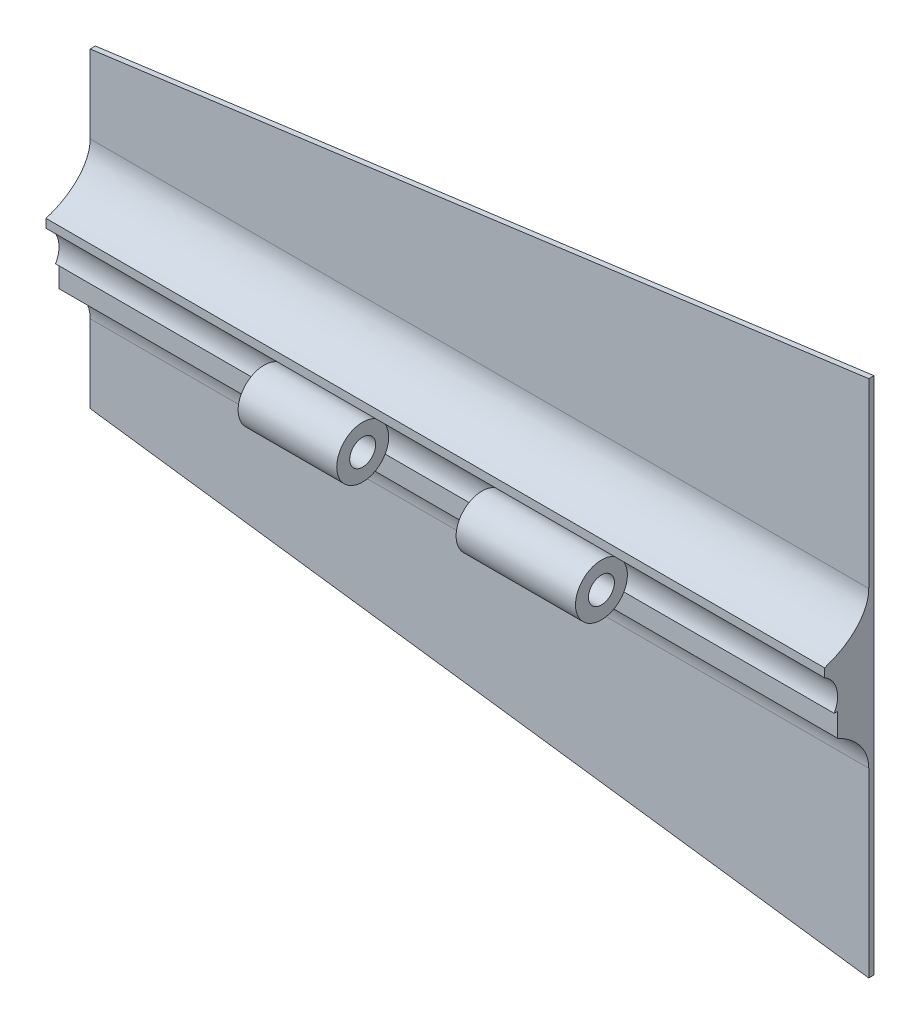
ISO-10303-21;
HEADER;
FILE_DESCRIPTION(('STEP AP214'),'2;1');
FILE_NAME('part.step','',(''),(''),'','','');
FILE_SCHEMA(('AUTOMOTIVE_DESIGN { 1 0 10303 214 1 1 1 1 }'));
ENDSEC;
DATA;
#1=APPLICATION_CONTEXT('core data for automotive mechanical design processes');
#2=APPLICATION_PROTOCOL_DEFINITION('international standard','automotive_design',2000,#1);
#3=PRODUCT_CONTEXT('',#1,'mechanical');
#4=PRODUCT('Part','Part','',(#3));
#5=PRODUCT_RELATED_PRODUCT_CATEGORY('part','',(#4));
#6=PRODUCT_DEFINITION_FORMATION('','',#4);
#7=PRODUCT_DEFINITION_CONTEXT('part definition',#1,'design');
#8=PRODUCT_DEFINITION('design','',#6,#7);
#9=PRODUCT_DEFINITION_SHAPE('','',#8);
#10=(LENGTH_UNIT() NAMED_UNIT(*) SI_UNIT(.MILLI.,.METRE.));
#11=(NAMED_UNIT(*) PLANE_ANGLE_UNIT() SI_UNIT($,.RADIAN.));
#12=(NAMED_UNIT(*) SI_UNIT($,.STERADIAN.) SOLID_ANGLE_UNIT());
#13=UNCERTAINTY_MEASURE_WITH_UNIT(LENGTH_MEASURE(1.E-05),#10,'distance_accuracy_value','');
#14=(GEOMETRIC_REPRESENTATION_CONTEXT(3) GLOBAL_UNCERTAINTY_ASSIGNED_CONTEXT((#13)) GLOBAL_UNIT_ASSIGNED_CONTEXT((#10,
#11,#12)) REPRESENTATION_CONTEXT('',''));
#15=CARTESIAN_POINT('',(0.,0.,0.));
#16=DIRECTION('',(0.,0.,1.));
#17=DIRECTION('',(1.,0.,0.));
#18=AXIS2_PLACEMENT_3D('',#15,#16,#17);
#19=CARTESIAN_POINT('',(82.5,-15.,0.999999999999999));
#20=CARTESIAN_POINT('',(27.5000000000001,-15.,0.999999999999999));
#21=CARTESIAN_POINT('',(-27.5000000000001,-15.,0.999999999999999));
#22=CARTESIAN_POINT('',(-82.5,-15.,0.999999999999999));
#23=CARTESIAN_POINT('',(82.5,-5.,0.999999999999999));
#24=CARTESIAN_POINT('',(27.5000000000001,-5.,0.999999999999999));
#25=CARTESIAN_POINT('',(-27.5000000000001,-5.,0.999999999999999));
#26=CARTESIAN_POINT('',(-82.5,-5.,0.999999999999999));
#27=CARTESIAN_POINT('',(82.5,-5.,16.));
#28=CARTESIAN_POINT('',(27.5000000000001,-5.,16.));
#29=CARTESIAN_POINT('',(-27.5000000000001,-5.,16.));
#30=CARTESIAN_POINT('',(-82.5,-5.,16.));
#31=(BOUNDED_SURFACE() B_SPLINE_SURFACE(2,3,((#19,#20,#21,#22),(#23,#24,#25,#26),(#27,#28,#29,
#30)),.UNSPECIFIED.,.F.,.F.,.F.) B_SPLINE_SURFACE_WITH_KNOTS((3,3),(4,4),(0.,1.),(-0.0825,
0.0825),.UNSPECIFIED.) GEOMETRIC_REPRESENTATION_ITEM() RATIONAL_B_SPLINE_SURFACE(((1.,1.,1.,1.),
(0.707106781186548,0.707106781186548,0.707106781186548,0.707106781186548),(1.,1.,1.,1.))) REPRESENTATION_ITEM('') SURFACE());
#32=DIRECTION('',(-1.,0.,0.));
#33=VECTOR('',#32,1.);
#34=CARTESIAN_POINT('',(0.,-6.9999999999994,7.00000000000118));
#35=LINE('',#34,#33);
#36=CARTESIAN_POINT('',(-75.,-6.99992641783472,6.99999994950497));
#37=VERTEX_POINT('',#36);
#38=CARTESIAN_POINT('',(75.,-6.99992684584464,6.99999993353753));
#39=VERTEX_POINT('',#38);
#40=EDGE_CURVE('E64',#37,#39,#35,.F.);
#41=CARTESIAN_POINT('',(-75.,-5.,16.));
#42=CARTESIAN_POINT('',(-75.,-5.,0.999999999999999));
#43=CARTESIAN_POINT('',(-75.,-15.,0.999999999999999));
#44=(BOUNDED_CURVE() B_SPLINE_CURVE(2,(#41,#42,#43),.UNSPECIFIED.,.F.,
.F.) B_SPLINE_CURVE_WITH_KNOTS((3,3),(0.,1.),
.UNSPECIFIED.) CURVE() GEOMETRIC_REPRESENTATION_ITEM() RATIONAL_B_SPLINE_CURVE((1.,
0.707106781186548,1.)) REPRESENTATION_ITEM(''));
#45=CARTESIAN_POINT('',(-75.,-15.,1.));
#46=VERTEX_POINT('',#45);
#47=EDGE_CURVE('E343',#46,#37,#44,.F.);
#48=CARTESIAN_POINT('',(-82.5,-15.,0.999999999999999));
#49=CARTESIAN_POINT('',(-27.5000000000001,-15.,0.999999999999999));
#50=CARTESIAN_POINT('',(27.5000000000001,-15.,0.999999999999999));
#51=CARTESIAN_POINT('',(82.5,-15.,0.999999999999999));
#52=(BOUNDED_CURVE() B_SPLINE_CURVE(3,(#48,#49,#50,#51),.UNSPECIFIED.,.F.,
.F.) B_SPLINE_CURVE_WITH_KNOTS((4,4),(-0.0825,0.0825),
.UNSPECIFIED.) CURVE() GEOMETRIC_REPRESENTATION_ITEM() RATIONAL_B_SPLINE_CURVE((1.,1.,1.,1.)) REPRESENTATION_ITEM(''));
#53=CARTESIAN_POINT('',(75.,-15.,1.));
#54=VERTEX_POINT('',#53);
#55=EDGE_CURVE('E379',#54,#46,#52,.F.);
#56=CARTESIAN_POINT('',(75.,-15.,0.999999999999999));
#57=CARTESIAN_POINT('',(75.,-5.,0.999999999999999));
#58=CARTESIAN_POINT('',(75.,-5.,16.));
#59=(BOUNDED_CURVE() B_SPLINE_CURVE(2,(#56,#57,#58),.UNSPECIFIED.,.F.,
.F.) B_SPLINE_CURVE_WITH_KNOTS((3,3),(0.,1.),
.UNSPECIFIED.) CURVE() GEOMETRIC_REPRESENTATION_ITEM() RATIONAL_B_SPLINE_CURVE((1.,
0.707106781186548,1.)) REPRESENTATION_ITEM(''));
#60=EDGE_CURVE('E359',#39,#54,#59,.F.);
#61=ORIENTED_EDGE('',*,*,#40,.F.);
#62=ORIENTED_EDGE('',*,*,#47,.F.);
#63=ORIENTED_EDGE('',*,*,#55,.F.);
#64=ORIENTED_EDGE('',*,*,#60,.F.);
#65=EDGE_LOOP('',(#61,#62,#63,#64));
#66=FACE_BOUND('',#65,.T.);
#67=ADVANCED_FACE('F110',(#66),#31,.T.);
#68=CARTESIAN_POINT('',(154.,0.,12.));
#69=DIRECTION('',(-1.,0.,0.));
#70=DIRECTION('',(0.,0.,1.));
#71=AXIS2_PLACEMENT_3D('',#68,#69,#70);
#72=CYLINDRICAL_SURFACE('',#71,5.);
#73=CARTESIAN_POINT('',(-75.,0.,12.));
#74=DIRECTION('',(-1.,0.,0.));
#75=DIRECTION('',(0.,0.,1.));
#76=AXIS2_PLACEMENT_3D('',#73,#74,#75);
#77=CIRCLE('',#76,5.);
#78=CARTESIAN_POINT('',(-75.,4.33012701892219,9.5));
#79=VERTEX_POINT('',#78);
#80=CARTESIAN_POINT('',(-75.,-2.49999999999967,7.66987298107762));
#81=VERTEX_POINT('',#80);
#82=EDGE_CURVE('E239',#79,#81,#77,.T.);
#83=ORIENTED_EDGE('',*,*,#82,.T.);
#84=DIRECTION('',(1.,0.,0.));
#85=VECTOR('',#84,1.);
#86=CARTESIAN_POINT('',(-101.5,-2.49999999999967,7.66987298107762));
#87=LINE('',#86,#85);
#88=CARTESIAN_POINT('',(-30.5,-2.49999999999967,7.66987298107762));
#89=VERTEX_POINT('',#88);
#90=EDGE_CURVE('E220',#81,#89,#87,.T.);
#91=ORIENTED_EDGE('',*,*,#90,.T.);
#92=CARTESIAN_POINT('',(-30.5,0.,12.));
#93=DIRECTION('',(1.,0.,0.));
#94=DIRECTION('',(0.,0.,-1.));
#95=AXIS2_PLACEMENT_3D('',#92,#93,#94);
#96=CIRCLE('',#95,5.);
#97=CARTESIAN_POINT('',(-30.5,4.33012701892219,9.5));
#98=VERTEX_POINT('',#97);
#99=EDGE_CURVE('E524',#89,#98,#96,.T.);
#100=ORIENTED_EDGE('',*,*,#99,.T.);
#101=DIRECTION('',(-1.,0.,0.));
#102=VECTOR('',#101,1.);
#103=CARTESIAN_POINT('',(154.,4.33012701892219,9.5));
#104=LINE('',#103,#102);
#105=EDGE_CURVE('E246',#98,#79,#104,.T.);
#106=ORIENTED_EDGE('',*,*,#105,.T.);
#107=EDGE_LOOP('',(#83,#91,#100,#106));
#108=FACE_BOUND('',#107,.T.);
#109=ADVANCED_FACE('F244',(#108),#72,.F.);
#110=CARTESIAN_POINT('',(-11.5,0.,12.));
#111=DIRECTION('',(1.,0.,0.));
#112=DIRECTION('',(0.,0.,-1.));
#113=AXIS2_PLACEMENT_3D('',#110,#111,#112);
#114=CIRCLE('',#113,5.);
#115=CARTESIAN_POINT('',(-11.5,-2.49999999999967,7.66987298107762));
#116=VERTEX_POINT('',#115);
#117=CARTESIAN_POINT('',(-11.5,4.33012701892219,9.5));
#118=VERTEX_POINT('',#117);
#119=EDGE_CURVE('E510',#116,#118,#114,.T.);
#120=ORIENTED_EDGE('',*,*,#119,.F.);
#121=CARTESIAN_POINT('',(11.5,-2.49999999999967,7.66987298107762));
#122=VERTEX_POINT('',#121);
#123=EDGE_CURVE('E511',#116,#122,#87,.T.);
#124=ORIENTED_EDGE('',*,*,#123,.T.);
#125=CARTESIAN_POINT('',(11.5,0.,12.));
#126=DIRECTION('',(1.,0.,0.));
#127=DIRECTION('',(0.,0.,-1.));
#128=AXIS2_PLACEMENT_3D('',#125,#126,#127);
#129=CIRCLE('',#128,5.);
#130=CARTESIAN_POINT('',(11.5,4.33012701892219,9.5));
#131=VERTEX_POINT('',#130);
#132=EDGE_CURVE('E120',#131,#122,#129,.F.);
#133=ORIENTED_EDGE('',*,*,#132,.F.);
#134=EDGE_CURVE('E506',#131,#118,#104,.T.);
#135=ORIENTED_EDGE('',*,*,#134,.T.);
#136=EDGE_LOOP('',(#120,#124,#133,#135));
#137=FACE_BOUND('',#136,.T.);
#138=ADVANCED_FACE('F475',(#137),#72,.F.);
#139=CARTESIAN_POINT('',(75.,50.,1.));
#140=DIRECTION('',(-1.,0.,0.));
#141=DIRECTION('',(0.,0.,1.));
#142=AXIS2_PLACEMENT_3D('',#139,#140,#141);
#143=PLANE('',#142);
#144=CARTESIAN_POINT('',(75.,0.,12.));
#145=DIRECTION('',(-1.,0.,0.));
#146=DIRECTION('',(0.,0.,1.));
#147=AXIS2_PLACEMENT_3D('',#144,#145,#146);
#148=CIRCLE('',#147,5.);
#149=CARTESIAN_POINT('',(75.,-2.49999999999967,7.66987298107762));
#150=VERTEX_POINT('',#149);
#151=CARTESIAN_POINT('',(75.,4.33012701892219,9.5));
#152=VERTEX_POINT('',#151);
#153=EDGE_CURVE('E134',#150,#152,#148,.F.);
#154=ORIENTED_EDGE('',*,*,#153,.F.);
#155=DIRECTION('',(0.,0.,-1.));
#156=VECTOR('',#155,1.);
#157=CARTESIAN_POINT('',(75.,-2.49999999999968,1.00000000000014));
#158=LINE('',#157,#156);
#159=CARTESIAN_POINT('',(75.,-2.49999999999967,7.00000000000118));
#160=VERTEX_POINT('',#159);
#161=EDGE_CURVE('E242',#150,#160,#158,.T.);
#162=ORIENTED_EDGE('',*,*,#161,.T.);
#163=DIRECTION('',(0.,1.,0.));
#164=VECTOR('',#163,1.);
#165=CARTESIAN_POINT('',(75.,50.,7.00000000000118));
#166=LINE('',#165,#164);
#167=EDGE_CURVE('E530',#39,#160,#166,.T.);
#168=ORIENTED_EDGE('',*,*,#167,.F.);
#169=ORIENTED_EDGE('',*,*,#60,.T.);
#170=DIRECTION('',(0.,1.,0.));
#171=VECTOR('',#170,1.);
#172=CARTESIAN_POINT('',(75.,50.,1.));
#173=LINE('',#172,#171);
#174=CARTESIAN_POINT('',(75.,-50.,1.));
#175=VERTEX_POINT('',#174);
#176=EDGE_CURVE('E355',#175,#54,#173,.T.);
#177=ORIENTED_EDGE('',*,*,#176,.F.);
#178=DIRECTION('',(0.,0.,-1.));
#179=VECTOR('',#178,1.);
#180=CARTESIAN_POINT('',(75.,-50.,1.));
#181=LINE('',#180,#179);
#182=CARTESIAN_POINT('',(75.,-50.,0.));
#183=VERTEX_POINT('',#182);
#184=EDGE_CURVE('E360',#175,#183,#181,.T.);
#185=ORIENTED_EDGE('',*,*,#184,.T.);
#186=DIRECTION('',(0.,1.,0.));
#187=VECTOR('',#186,1.);
#188=CARTESIAN_POINT('',(75.,50.,0.));
#189=LINE('',#188,#187);
#190=CARTESIAN_POINT('',(75.,50.,0.));
#191=VERTEX_POINT('',#190);
#192=EDGE_CURVE('E267',#183,#191,#189,.T.);
#193=ORIENTED_EDGE('',*,*,#192,.T.);
#194=DIRECTION('',(0.,0.,-1.));
#195=VECTOR('',#194,1.);
#196=CARTESIAN_POINT('',(75.,50.,1.));
#197=LINE('',#196,#195);
#198=CARTESIAN_POINT('',(75.,50.,1.));
#199=VERTEX_POINT('',#198);
#200=EDGE_CURVE('E337',#199,#191,#197,.T.);
#201=ORIENTED_EDGE('',*,*,#200,.F.);
#202=CARTESIAN_POINT('',(75.,15.,1.));
#203=VERTEX_POINT('',#202);
#204=EDGE_CURVE('E275',#203,#199,#173,.T.);
#205=ORIENTED_EDGE('',*,*,#204,.F.);
#206=CARTESIAN_POINT('',(75.,5.,16.));
#207=CARTESIAN_POINT('',(75.,5.,0.999999999999999));
#208=CARTESIAN_POINT('',(75.,15.,0.999999999999999));
#209=(BOUNDED_CURVE() B_SPLINE_CURVE(2,(#206,#207,#208),.UNSPECIFIED.,.F.,
.F.) B_SPLINE_CURVE_WITH_KNOTS((3,3),(0.,1.),
.UNSPECIFIED.) CURVE() GEOMETRIC_REPRESENTATION_ITEM() RATIONAL_B_SPLINE_CURVE((1.,
0.707106781186548,1.)) REPRESENTATION_ITEM(''));
#210=CARTESIAN_POINT('',(75.,5.98739600075717,9.50000020568901));
#211=VERTEX_POINT('',#210);
#212=EDGE_CURVE('E268',#203,#211,#209,.F.);
#213=ORIENTED_EDGE('',*,*,#212,.T.);
#214=DIRECTION('',(0.,-1.,0.));
#215=VECTOR('',#214,1.);
#216=CARTESIAN_POINT('',(75.,50.,9.5));
#217=LINE('',#216,#215);
#218=EDGE_CURVE('E265',#211,#152,#217,.T.);
#219=ORIENTED_EDGE('',*,*,#218,.T.);
#220=EDGE_LOOP('',(#154,#162,#168,#169,#177,#185,#193,#201,#205,#213,#219));
#221=FACE_BOUND('',#220,.T.);
#222=ADVANCED_FACE('F335',(#221),#143,.F.);
#223=CARTESIAN_POINT('',(0.,0.,1.));
#224=DIRECTION('',(0.,0.,-1.));
#225=DIRECTION('',(-1.,0.,0.));
#226=AXIS2_PLACEMENT_3D('',#223,#224,#225);
#227=PLANE('',#226);
#228=DIRECTION('',(0.,-1.,0.));
#229=VECTOR('',#228,1.);
#230=CARTESIAN_POINT('',(-75.,-30.,1.));
#231=LINE('',#230,#229);
#232=CARTESIAN_POINT('',(-75.,30.,1.));
#233=VERTEX_POINT('',#232);
#234=CARTESIAN_POINT('',(-75.,15.,1.));
#235=VERTEX_POINT('',#234);
#236=EDGE_CURVE('E286',#233,#235,#231,.T.);
#237=ORIENTED_EDGE('',*,*,#236,.T.);
#238=CARTESIAN_POINT('',(82.5,15.,0.999999999999999));
#239=CARTESIAN_POINT('',(27.5000000000001,15.,0.999999999999999));
#240=CARTESIAN_POINT('',(-27.5000000000001,15.,0.999999999999999));
#241=CARTESIAN_POINT('',(-82.5,15.,0.999999999999999));
#242=(BOUNDED_CURVE() B_SPLINE_CURVE(3,(#238,#239,#240,#241),.UNSPECIFIED.,.F.,
.F.) B_SPLINE_CURVE_WITH_KNOTS((4,4),(-0.0825,0.0825),
.UNSPECIFIED.) CURVE() GEOMETRIC_REPRESENTATION_ITEM() RATIONAL_B_SPLINE_CURVE((1.,1.,1.,1.)) REPRESENTATION_ITEM(''));
#243=EDGE_CURVE('E290',#235,#203,#242,.F.);
#244=ORIENTED_EDGE('',*,*,#243,.T.);
#245=ORIENTED_EDGE('',*,*,#204,.T.);
#246=DIRECTION('',(-0.991227900682635,-0.132163720091018,0.));
#247=VECTOR('',#246,1.);
#248=CARTESIAN_POINT('',(-75.,30.,1.));
#249=LINE('',#248,#247);
#250=EDGE_CURVE('E271',#199,#233,#249,.T.);
#251=ORIENTED_EDGE('',*,*,#250,.T.);
#252=EDGE_LOOP('',(#237,#244,#245,#251));
#253=FACE_BOUND('',#252,.T.);
#254=ADVANCED_FACE('F309',(#253),#227,.F.);
#255=CARTESIAN_POINT('',(-75.,30.,1.));
#256=DIRECTION('',(0.132163720091018,-0.991227900682635,0.));
#257=DIRECTION('',(0.991227900682635,0.132163720091018,0.));
#258=AXIS2_PLACEMENT_3D('',#255,#256,#257);
#259=PLANE('',#258);
#260=DIRECTION('',(-0.991227900682635,-0.132163720091018,0.));
#261=VECTOR('',#260,1.);
#262=CARTESIAN_POINT('',(-75.,30.,0.));
#263=LINE('',#262,#261);
#264=CARTESIAN_POINT('',(-75.,30.,0.));
#265=VERTEX_POINT('',#264);
#266=EDGE_CURVE('E274',#191,#265,#263,.T.);
#267=ORIENTED_EDGE('',*,*,#266,.T.);
#268=DIRECTION('',(0.,0.,-1.));
#269=VECTOR('',#268,1.);
#270=CARTESIAN_POINT('',(-75.,30.,1.));
#271=LINE('',#270,#269);
#272=EDGE_CURVE('E348',#233,#265,#271,.T.);
#273=ORIENTED_EDGE('',*,*,#272,.F.);
#274=ORIENTED_EDGE('',*,*,#250,.F.);
#275=ORIENTED_EDGE('',*,*,#200,.T.);
#276=EDGE_LOOP('',(#267,#273,#274,#275));
#277=FACE_BOUND('',#276,.T.);
#278=ADVANCED_FACE('F346',(#277),#259,.F.);
#279=CARTESIAN_POINT('',(-75.,-30.,1.));
#280=DIRECTION('',(1.,0.,0.));
#281=DIRECTION('',(0.,0.,-1.));
#282=AXIS2_PLACEMENT_3D('',#279,#280,#281);
#283=PLANE('',#282);
#284=DIRECTION('',(0.,-1.,0.));
#285=VECTOR('',#284,1.);
#286=CARTESIAN_POINT('',(-75.,-30.,7.00000000000118));
#287=LINE('',#286,#285);
#288=CARTESIAN_POINT('',(-75.,-2.49999999999967,7.00000000000118));
#289=VERTEX_POINT('',#288);
#290=EDGE_CURVE('E241',#289,#37,#287,.T.);
#291=ORIENTED_EDGE('',*,*,#290,.F.);
#292=DIRECTION('',(0.,0.,1.));
#293=VECTOR('',#292,1.);
#294=CARTESIAN_POINT('',(-75.,-2.49999999999969,0.999999999999929));
#295=LINE('',#294,#293);
#296=EDGE_CURVE('E225',#289,#81,#295,.T.);
#297=ORIENTED_EDGE('',*,*,#296,.T.);
#298=ORIENTED_EDGE('',*,*,#82,.F.);
#299=DIRECTION('',(0.,-1.,0.));
#300=VECTOR('',#299,1.);
#301=CARTESIAN_POINT('',(-75.,6.98677371199543,9.5));
#302=LINE('',#301,#300);
#303=CARTESIAN_POINT('',(-75.,5.98712538062173,9.5));
#304=VERTEX_POINT('',#303);
#305=EDGE_CURVE('E262',#304,#79,#302,.T.);
#306=ORIENTED_EDGE('',*,*,#305,.F.);
#307=CARTESIAN_POINT('',(-75.,15.,0.999999999999999));
#308=CARTESIAN_POINT('',(-75.,5.,0.999999999999999));
#309=CARTESIAN_POINT('',(-75.,5.,16.));
#310=(BOUNDED_CURVE() B_SPLINE_CURVE(2,(#307,#308,#309),.UNSPECIFIED.,.F.,
.F.) B_SPLINE_CURVE_WITH_KNOTS((3,3),(0.,1.),
.UNSPECIFIED.) CURVE() GEOMETRIC_REPRESENTATION_ITEM() RATIONAL_B_SPLINE_CURVE((1.,
0.707106781186548,1.)) REPRESENTATION_ITEM(''));
#311=EDGE_CURVE('E350',#304,#235,#310,.F.);
#312=ORIENTED_EDGE('',*,*,#311,.T.);
#313=ORIENTED_EDGE('',*,*,#236,.F.);
#314=ORIENTED_EDGE('',*,*,#272,.T.);
#315=DIRECTION('',(0.,-1.,0.));
#316=VECTOR('',#315,1.);
#317=CARTESIAN_POINT('',(-75.,-30.,0.));
#318=LINE('',#317,#316);
#319=CARTESIAN_POINT('',(-75.,-30.,0.));
#320=VERTEX_POINT('',#319);
#321=EDGE_CURVE('E349',#265,#320,#318,.T.);
#322=ORIENTED_EDGE('',*,*,#321,.T.);
#323=DIRECTION('',(0.,0.,-1.));
#324=VECTOR('',#323,1.);
#325=CARTESIAN_POINT('',(-75.,-30.,1.));
#326=LINE('',#325,#324);
#327=CARTESIAN_POINT('',(-75.,-30.,1.));
#328=VERTEX_POINT('',#327);
#329=EDGE_CURVE('E356',#328,#320,#326,.T.);
#330=ORIENTED_EDGE('',*,*,#329,.F.);
#331=EDGE_CURVE('E282',#46,#328,#231,.T.);
#332=ORIENTED_EDGE('',*,*,#331,.F.);
#333=ORIENTED_EDGE('',*,*,#47,.T.);
#334=EDGE_LOOP('',(#291,#297,#298,#306,#312,#313,#314,#322,#330,#332,#333));
#335=FACE_BOUND('',#334,.T.);
#336=ADVANCED_FACE('F112',(#335),#283,.F.);
#337=CARTESIAN_POINT('',(75.,-50.,1.));
#338=DIRECTION('',(0.132163720091018,0.991227900682635,0.));
#339=DIRECTION('',(-0.991227900682635,0.132163720091018,0.));
#340=AXIS2_PLACEMENT_3D('',#337,#338,#339);
#341=PLANE('',#340);
#342=DIRECTION('',(0.991227900682635,-0.132163720091018,0.));
#343=VECTOR('',#342,1.);
#344=CARTESIAN_POINT('',(75.,-50.,0.));
#345=LINE('',#344,#343);
#346=EDGE_CURVE('E352',#320,#183,#345,.T.);
#347=ORIENTED_EDGE('',*,*,#346,.T.);
#348=ORIENTED_EDGE('',*,*,#184,.F.);
#349=DIRECTION('',(0.991227900682635,-0.132163720091018,0.));
#350=VECTOR('',#349,1.);
#351=CARTESIAN_POINT('',(75.,-50.,1.));
#352=LINE('',#351,#350);
#353=EDGE_CURVE('E278',#328,#175,#352,.T.);
#354=ORIENTED_EDGE('',*,*,#353,.F.);
#355=ORIENTED_EDGE('',*,*,#329,.T.);
#356=EDGE_LOOP('',(#347,#348,#354,#355));
#357=FACE_BOUND('',#356,.T.);
#358=ADVANCED_FACE('F307',(#357),#341,.F.);
#359=ORIENTED_EDGE('',*,*,#176,.T.);
#360=ORIENTED_EDGE('',*,*,#55,.T.);
#361=ORIENTED_EDGE('',*,*,#331,.T.);
#362=ORIENTED_EDGE('',*,*,#353,.T.);
#363=EDGE_LOOP('',(#359,#360,#361,#362));
#364=FACE_BOUND('',#363,.T.);
#365=ADVANCED_FACE('F296',(#364),#227,.F.);
#366=CARTESIAN_POINT('',(0.,0.,0.));
#367=DIRECTION('',(0.,0.,-1.));
#368=DIRECTION('',(-1.,0.,0.));
#369=AXIS2_PLACEMENT_3D('',#366,#367,#368);
#370=PLANE('',#369);
#371=ORIENTED_EDGE('',*,*,#192,.F.);
#372=ORIENTED_EDGE('',*,*,#346,.F.);
#373=ORIENTED_EDGE('',*,*,#321,.F.);
#374=ORIENTED_EDGE('',*,*,#266,.F.);
#375=EDGE_LOOP('',(#371,#372,#373,#374));
#376=FACE_BOUND('',#375,.T.);
#377=ADVANCED_FACE('F306',(#376),#370,.T.);
#378=CARTESIAN_POINT('',(-82.5,15.,0.999999999999999));
#379=CARTESIAN_POINT('',(-27.5000000000001,15.,0.999999999999999));
#380=CARTESIAN_POINT('',(27.5000000000001,15.,0.999999999999999));
#381=CARTESIAN_POINT('',(82.5,15.,0.999999999999999));
#382=CARTESIAN_POINT('',(-82.5,5.,0.999999999999999));
#383=CARTESIAN_POINT('',(-27.5000000000001,5.,0.999999999999999));
#384=CARTESIAN_POINT('',(27.5000000000001,5.,0.999999999999999));
#385=CARTESIAN_POINT('',(82.5,5.,0.999999999999999));
#386=CARTESIAN_POINT('',(-82.5,5.,16.));
#387=CARTESIAN_POINT('',(-27.5000000000001,5.,16.));
#388=CARTESIAN_POINT('',(27.5000000000001,5.,16.));
#389=CARTESIAN_POINT('',(82.5,5.,16.));
#390=(BOUNDED_SURFACE() B_SPLINE_SURFACE(2,3,((#378,#379,#380,#381),(#382,#383,#384,#385),(#386,
#387,#388,#389)),.UNSPECIFIED.,.F.,.F.,.F.) B_SPLINE_SURFACE_WITH_KNOTS((3,3),(4,4),(0.,1.),
(-0.0825,0.0825),.UNSPECIFIED.) GEOMETRIC_REPRESENTATION_ITEM() RATIONAL_B_SPLINE_SURFACE(((1.,
1.,1.,1.),(0.707106781186548,0.707106781186548,0.707106781186548,0.707106781186548),(1.,1.,1.,1.))) REPRESENTATION_ITEM('') SURFACE());
#391=DIRECTION('',(1.,0.,0.));
#392=VECTOR('',#391,1.);
#393=CARTESIAN_POINT('',(0.,5.98766277693615,9.5));
#394=LINE('',#393,#392);
#395=EDGE_CURVE('E264',#304,#211,#394,.T.);
#396=ORIENTED_EDGE('',*,*,#311,.F.);
#397=ORIENTED_EDGE('',*,*,#395,.T.);
#398=ORIENTED_EDGE('',*,*,#212,.F.);
#399=ORIENTED_EDGE('',*,*,#243,.F.);
#400=EDGE_LOOP('',(#396,#397,#398,#399));
#401=FACE_BOUND('',#400,.T.);
#402=ADVANCED_FACE('F401',(#401),#390,.T.);
#403=CARTESIAN_POINT('',(154.,6.98677371199543,9.5));
#404=DIRECTION('',(0.,0.,-1.));
#405=DIRECTION('',(-1.,0.,0.));
#406=AXIS2_PLACEMENT_3D('',#403,#404,#405);
#407=PLANE('',#406);
#408=CARTESIAN_POINT('',(34.5,4.33012701892219,9.5));
#409=VERTEX_POINT('',#408);
#410=EDGE_CURVE('E248',#152,#409,#104,.T.);
#411=ORIENTED_EDGE('',*,*,#410,.F.);
#412=ORIENTED_EDGE('',*,*,#218,.F.);
#413=ORIENTED_EDGE('',*,*,#395,.F.);
#414=ORIENTED_EDGE('',*,*,#305,.T.);
#415=ORIENTED_EDGE('',*,*,#105,.F.);
#416=DIRECTION('',(1.,0.,0.));
#417=VECTOR('',#416,1.);
#418=CARTESIAN_POINT('',(-30.5,4.33012701892219,9.5));
#419=LINE('',#418,#417);
#420=EDGE_CURVE('E518',#98,#118,#419,.T.);
#421=ORIENTED_EDGE('',*,*,#420,.T.);
#422=ORIENTED_EDGE('',*,*,#134,.F.);
#423=EDGE_CURVE('E252',#409,#131,#104,.T.);
#424=ORIENTED_EDGE('',*,*,#423,.F.);
#425=EDGE_LOOP('',(#411,#412,#413,#414,#415,#421,#422,#424));
#426=FACE_BOUND('',#425,.T.);
#427=ADVANCED_FACE('F311',(#426),#407,.F.);
#428=CARTESIAN_POINT('',(34.5,0.,12.));
#429=DIRECTION('',(1.,0.,0.));
#430=DIRECTION('',(0.,0.,-1.));
#431=AXIS2_PLACEMENT_3D('',#428,#429,#430);
#432=CIRCLE('',#431,5.);
#433=CARTESIAN_POINT('',(34.5,-2.49999999999967,7.66987298107762));
#434=VERTEX_POINT('',#433);
#435=EDGE_CURVE('E250',#409,#434,#432,.F.);
#436=ORIENTED_EDGE('',*,*,#435,.T.);
#437=EDGE_CURVE('E234',#434,#150,#87,.T.);
#438=ORIENTED_EDGE('',*,*,#437,.T.);
#439=ORIENTED_EDGE('',*,*,#153,.T.);
#440=ORIENTED_EDGE('',*,*,#410,.T.);
#441=EDGE_LOOP('',(#436,#438,#439,#440));
#442=FACE_BOUND('',#441,.T.);
#443=ADVANCED_FACE('F476',(#442),#72,.F.);
#444=CARTESIAN_POINT('',(11.5,0.,12.));
#445=DIRECTION('',(1.,0.,0.));
#446=DIRECTION('',(0.,0.,-1.));
#447=AXIS2_PLACEMENT_3D('',#444,#445,#446);
#448=CYLINDRICAL_SURFACE('',#447,5.);
#449=ORIENTED_EDGE('',*,*,#423,.T.);
#450=CARTESIAN_POINT('',(11.5,0.,12.));
#451=DIRECTION('',(1.,0.,0.));
#452=DIRECTION('',(0.,0.,-1.));
#453=AXIS2_PLACEMENT_3D('',#450,#451,#452);
#454=CIRCLE('',#453,5.);
#455=EDGE_CURVE('E501',#131,#122,#454,.T.);
#456=ORIENTED_EDGE('',*,*,#455,.T.);
#457=EDGE_CURVE('E500',#122,#434,#87,.T.);
#458=ORIENTED_EDGE('',*,*,#457,.T.);
#459=CARTESIAN_POINT('',(34.5,0.,12.));
#460=DIRECTION('',(1.,0.,0.));
#461=DIRECTION('',(0.,0.,-1.));
#462=AXIS2_PLACEMENT_3D('',#459,#460,#461);
#463=CIRCLE('',#462,5.);
#464=EDGE_CURVE('E495',#409,#434,#463,.T.);
#465=ORIENTED_EDGE('',*,*,#464,.F.);
#466=EDGE_LOOP('',(#449,#456,#458,#465));
#467=FACE_BOUND('',#466,.T.);
#468=ADVANCED_FACE('F482',(#467),#448,.T.);
#469=CARTESIAN_POINT('',(11.5,0.,12.));
#470=DIRECTION('',(1.,0.,0.));
#471=DIRECTION('',(0.,0.,-1.));
#472=AXIS2_PLACEMENT_3D('',#469,#470,#471);
#473=PLANE('',#472);
#474=CARTESIAN_POINT('',(11.5,0.,12.));
#475=DIRECTION('',(1.,0.,0.));
#476=DIRECTION('',(0.,0.,-1.));
#477=AXIS2_PLACEMENT_3D('',#474,#475,#476);
#478=CIRCLE('',#477,2.5);
#479=CARTESIAN_POINT('',(11.5,0.,9.5));
#480=VERTEX_POINT('',#479);
#481=EDGE_CURVE('E502',#480,#480,#478,.T.);
#482=ORIENTED_EDGE('',*,*,#481,.T.);
#483=EDGE_LOOP('',(#482));
#484=FACE_BOUND('',#483,.T.);
#485=ORIENTED_EDGE('',*,*,#455,.F.);
#486=ORIENTED_EDGE('',*,*,#132,.T.);
#487=EDGE_LOOP('',(#485,#486));
#488=FACE_BOUND('',#487,.T.);
#489=ADVANCED_FACE('F487',(#484,#488),#473,.F.);
#490=CARTESIAN_POINT('',(34.5,0.,12.));
#491=DIRECTION('',(1.,0.,0.));
#492=DIRECTION('',(0.,0.,-1.));
#493=AXIS2_PLACEMENT_3D('',#490,#491,#492);
#494=PLANE('',#493);
#495=CARTESIAN_POINT('',(34.5,0.,12.));
#496=DIRECTION('',(1.,0.,0.));
#497=DIRECTION('',(0.,0.,-1.));
#498=AXIS2_PLACEMENT_3D('',#495,#496,#497);
#499=CIRCLE('',#498,2.5);
#500=CARTESIAN_POINT('',(34.5,0.,9.5));
#501=VERTEX_POINT('',#500);
#502=EDGE_CURVE('E515',#501,#501,#499,.T.);
#503=ORIENTED_EDGE('',*,*,#502,.F.);
#504=EDGE_LOOP('',(#503));
#505=FACE_BOUND('',#504,.T.);
#506=ORIENTED_EDGE('',*,*,#464,.T.);
#507=ORIENTED_EDGE('',*,*,#435,.F.);
#508=EDGE_LOOP('',(#506,#507));
#509=FACE_BOUND('',#508,.T.);
#510=ADVANCED_FACE('F494',(#505,#509),#494,.T.);
#511=CARTESIAN_POINT('',(11.5,0.,12.));
#512=DIRECTION('',(1.,0.,0.));
#513=DIRECTION('',(0.,0.,-1.));
#514=AXIS2_PLACEMENT_3D('',#511,#512,#513);
#515=CYLINDRICAL_SURFACE('',#514,2.5);
#516=ORIENTED_EDGE('',*,*,#481,.F.);
#517=EDGE_LOOP('',(#516));
#518=FACE_BOUND('',#517,.T.);
#519=ORIENTED_EDGE('',*,*,#502,.T.);
#520=EDGE_LOOP('',(#519));
#521=FACE_BOUND('',#520,.T.);
#522=ADVANCED_FACE('F558',(#518,#521),#515,.F.);
#523=CARTESIAN_POINT('',(-30.5,0.,12.));
#524=DIRECTION('',(1.,0.,0.));
#525=DIRECTION('',(0.,0.,-1.));
#526=AXIS2_PLACEMENT_3D('',#523,#524,#525);
#527=CYLINDRICAL_SURFACE('',#526,5.);
#528=ORIENTED_EDGE('',*,*,#420,.F.);
#529=EDGE_CURVE('E522',#98,#89,#96,.T.);
#530=ORIENTED_EDGE('',*,*,#529,.T.);
#531=EDGE_CURVE('E228',#89,#116,#87,.T.);
#532=ORIENTED_EDGE('',*,*,#531,.T.);
#533=EDGE_CURVE('E126',#118,#116,#114,.T.);
#534=ORIENTED_EDGE('',*,*,#533,.F.);
#535=EDGE_LOOP('',(#528,#530,#532,#534));
#536=FACE_BOUND('',#535,.T.);
#537=ADVANCED_FACE('F544',(#536),#527,.T.);
#538=CARTESIAN_POINT('',(-30.5,0.,12.));
#539=DIRECTION('',(1.,0.,0.));
#540=DIRECTION('',(0.,0.,-1.));
#541=AXIS2_PLACEMENT_3D('',#538,#539,#540);
#542=PLANE('',#541);
#543=CARTESIAN_POINT('',(-30.5,0.,12.));
#544=DIRECTION('',(1.,0.,0.));
#545=DIRECTION('',(0.,0.,-1.));
#546=AXIS2_PLACEMENT_3D('',#543,#544,#545);
#547=CIRCLE('',#546,2.5);
#548=CARTESIAN_POINT('',(-30.5,0.,9.5));
#549=VERTEX_POINT('',#548);
#550=EDGE_CURVE('E529',#549,#549,#547,.T.);
#551=ORIENTED_EDGE('',*,*,#550,.T.);
#552=EDGE_LOOP('',(#551));
#553=FACE_BOUND('',#552,.T.);
#554=ORIENTED_EDGE('',*,*,#529,.F.);
#555=ORIENTED_EDGE('',*,*,#99,.F.);
#556=EDGE_LOOP('',(#554,#555));
#557=FACE_BOUND('',#556,.T.);
#558=ADVANCED_FACE('F546',(#553,#557),#542,.F.);
#559=CARTESIAN_POINT('',(-11.5,0.,12.));
#560=DIRECTION('',(1.,0.,0.));
#561=DIRECTION('',(0.,0.,-1.));
#562=AXIS2_PLACEMENT_3D('',#559,#560,#561);
#563=PLANE('',#562);
#564=CARTESIAN_POINT('',(-11.5,0.,12.));
#565=DIRECTION('',(1.,0.,0.));
#566=DIRECTION('',(0.,0.,-1.));
#567=AXIS2_PLACEMENT_3D('',#564,#565,#566);
#568=CIRCLE('',#567,2.5);
#569=CARTESIAN_POINT('',(-11.5,0.,9.5));
#570=VERTEX_POINT('',#569);
#571=EDGE_CURVE('E526',#570,#570,#568,.T.);
#572=ORIENTED_EDGE('',*,*,#571,.F.);
#573=EDGE_LOOP('',(#572));
#574=FACE_BOUND('',#573,.T.);
#575=ORIENTED_EDGE('',*,*,#533,.T.);
#576=ORIENTED_EDGE('',*,*,#119,.T.);
#577=EDGE_LOOP('',(#575,#576));
#578=FACE_BOUND('',#577,.T.);
#579=ADVANCED_FACE('F548',(#574,#578),#563,.T.);
#580=CARTESIAN_POINT('',(-30.5,0.,12.));
#581=DIRECTION('',(1.,0.,0.));
#582=DIRECTION('',(0.,0.,-1.));
#583=AXIS2_PLACEMENT_3D('',#580,#581,#582);
#584=CYLINDRICAL_SURFACE('',#583,2.5);
#585=ORIENTED_EDGE('',*,*,#550,.F.);
#586=EDGE_LOOP('',(#585));
#587=FACE_BOUND('',#586,.T.);
#588=ORIENTED_EDGE('',*,*,#571,.T.);
#589=EDGE_LOOP('',(#588));
#590=FACE_BOUND('',#589,.T.);
#591=ADVANCED_FACE('F555',(#587,#590),#584,.F.);
#592=CARTESIAN_POINT('',(-101.5,-2.49999999999967,7.00000000000118));
#593=DIRECTION('',(0.,0.,1.));
#594=DIRECTION('',(1.,0.,0.));
#595=AXIS2_PLACEMENT_3D('',#592,#593,#594);
#596=PLANE('',#595);
#597=ORIENTED_EDGE('',*,*,#167,.T.);
#598=DIRECTION('',(1.,0.,0.));
#599=VECTOR('',#598,1.);
#600=CARTESIAN_POINT('',(-101.5,-2.49999999999967,7.00000000000118));
#601=LINE('',#600,#599);
#602=EDGE_CURVE('E232',#289,#160,#601,.T.);
#603=ORIENTED_EDGE('',*,*,#602,.F.);
#604=ORIENTED_EDGE('',*,*,#290,.T.);
#605=ORIENTED_EDGE('',*,*,#40,.T.);
#606=EDGE_LOOP('',(#597,#603,#604,#605));
#607=FACE_BOUND('',#606,.T.);
#608=ADVANCED_FACE('F618',(#607),#596,.T.);
#609=CARTESIAN_POINT('',(-101.5,-2.49999999999967,7.00000000000118));
#610=DIRECTION('',(0.,1.,0.));
#611=DIRECTION('',(0.,0.,1.));
#612=AXIS2_PLACEMENT_3D('',#609,#610,#611);
#613=PLANE('',#612);
#614=ORIENTED_EDGE('',*,*,#437,.F.);
#615=ORIENTED_EDGE('',*,*,#457,.F.);
#616=ORIENTED_EDGE('',*,*,#123,.F.);
#617=ORIENTED_EDGE('',*,*,#531,.F.);
#618=ORIENTED_EDGE('',*,*,#90,.F.);
#619=ORIENTED_EDGE('',*,*,#296,.F.);
#620=ORIENTED_EDGE('',*,*,#602,.T.);
#621=ORIENTED_EDGE('',*,*,#161,.F.);
#622=EDGE_LOOP('',(#614,#615,#616,#617,#618,#619,#620,#621));
#623=FACE_BOUND('',#622,.T.);
#624=ADVANCED_FACE('F223',(#623),#613,.F.);
#625=CLOSED_SHELL('',(#67,#109,#138,#222,#254,#278,#336,#358,#365,#377,#402,#427,#443,#468,#489,
#510,#522,#537,#558,#579,#591,#608,#624));
#626=MANIFOLD_SOLID_BREP('B7',#625);
#627=ADVANCED_BREP_SHAPE_REPRESENTATION('',(#18,#626),#14);
#628=SHAPE_DEFINITION_REPRESENTATION(#9,#627);
ENDSEC;
END-ISO-10303-21;
